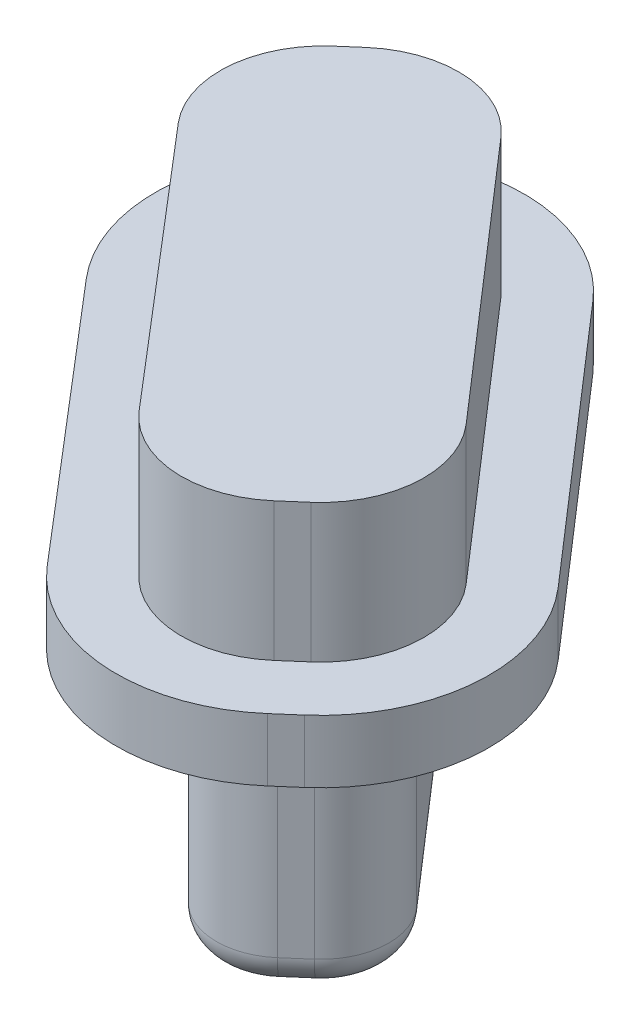
ISO-10303-21;
HEADER;
FILE_DESCRIPTION(('STEP AP214'),'2;1');
FILE_NAME('part.step','',(''),(''),'','','');
FILE_SCHEMA(('AUTOMOTIVE_DESIGN { 1 0 10303 214 1 1 1 1 }'));
ENDSEC;
DATA;
#1=APPLICATION_CONTEXT('core data for automotive mechanical design processes');
#2=APPLICATION_PROTOCOL_DEFINITION('international standard','automotive_design',2000,#1);
#3=PRODUCT_CONTEXT('',#1,'mechanical');
#4=PRODUCT('Part','Part','',(#3));
#5=PRODUCT_RELATED_PRODUCT_CATEGORY('part','',(#4));
#6=PRODUCT_DEFINITION_FORMATION('','',#4);
#7=PRODUCT_DEFINITION_CONTEXT('part definition',#1,'design');
#8=PRODUCT_DEFINITION('design','',#6,#7);
#9=PRODUCT_DEFINITION_SHAPE('','',#8);
#10=(LENGTH_UNIT() NAMED_UNIT(*) SI_UNIT(.MILLI.,.METRE.));
#11=(NAMED_UNIT(*) PLANE_ANGLE_UNIT() SI_UNIT($,.RADIAN.));
#12=(NAMED_UNIT(*) SI_UNIT($,.STERADIAN.) SOLID_ANGLE_UNIT());
#13=UNCERTAINTY_MEASURE_WITH_UNIT(LENGTH_MEASURE(1.E-05),#10,'distance_accuracy_value','');
#14=(GEOMETRIC_REPRESENTATION_CONTEXT(3) GLOBAL_UNCERTAINTY_ASSIGNED_CONTEXT((#13)) GLOBAL_UNIT_ASSIGNED_CONTEXT((#10,
#11,#12)) REPRESENTATION_CONTEXT('',''));
#15=CARTESIAN_POINT('',(0.,0.,0.));
#16=DIRECTION('',(0.,0.,1.));
#17=DIRECTION('',(1.,0.,0.));
#18=AXIS2_PLACEMENT_3D('',#15,#16,#17);
#19=CARTESIAN_POINT('',(-137.992702700744,7.,-158.742445613972));
#20=DIRECTION('',(-0.656059028990518,0.,-0.754709580222763));
#21=DIRECTION('',(-0.754709580222763,0.,0.656059028990518));
#22=AXIS2_PLACEMENT_3D('',#19,#20,#21);
#23=PLANE('',#22);
#24=DIRECTION('',(0.754709580222763,0.,-0.656059028990518));
#25=VECTOR('',#24,1.);
#26=CARTESIAN_POINT('',(-137.992702700744,0.,-158.742445613972));
#27=LINE('',#26,#25);
#28=CARTESIAN_POINT('',(-397.046660629011,0.,66.44972439188));
#29=VERTEX_POINT('',#28);
#30=CARTESIAN_POINT('',(-396.047807587358,0.,65.5814346897433));
#31=VERTEX_POINT('',#30);
#32=EDGE_CURVE('E340',#29,#31,#27,.T.);
#33=ORIENTED_EDGE('',*,*,#32,.T.);
#34=DIRECTION('',(0.,-1.,0.));
#35=VECTOR('',#34,1.);
#36=CARTESIAN_POINT('',(-396.047807587358,7.,65.5814346897433));
#37=LINE('',#36,#35);
#38=CARTESIAN_POINT('',(-396.047807587358,7.,65.5814346897433));
#39=VERTEX_POINT('',#38);
#40=EDGE_CURVE('E402',#39,#31,#37,.T.);
#41=ORIENTED_EDGE('',*,*,#40,.F.);
#42=DIRECTION('',(0.754709580222763,0.,-0.656059028990518));
#43=VECTOR('',#42,1.);
#44=CARTESIAN_POINT('',(-137.992702700744,7.,-158.742445613972));
#45=LINE('',#44,#43);
#46=CARTESIAN_POINT('',(-397.046660629011,7.,66.44972439188));
#47=VERTEX_POINT('',#46);
#48=EDGE_CURVE('E341',#47,#39,#45,.T.);
#49=ORIENTED_EDGE('',*,*,#48,.F.);
#50=DIRECTION('',(0.,-1.,0.));
#51=VECTOR('',#50,1.);
#52=CARTESIAN_POINT('',(-397.046660629011,7.,66.44972439188));
#53=LINE('',#52,#51);
#54=EDGE_CURVE('E360',#47,#29,#53,.T.);
#55=ORIENTED_EDGE('',*,*,#54,.T.);
#56=EDGE_LOOP('',(#33,#41,#49,#55));
#57=FACE_BOUND('',#56,.T.);
#58=ADVANCED_FACE('F41',(#57),#23,.F.);
#59=CARTESIAN_POINT('',(-399.463906951311,7.,61.6516619055234));
#60=DIRECTION('',(0.,-1.,0.));
#61=DIRECTION('',(0.,0.,-1.));
#62=AXIS2_PLACEMENT_3D('',#59,#60,#61);
#63=CYLINDRICAL_SURFACE('',#62,5.20699999999999);
#64=CARTESIAN_POINT('',(-399.463906951311,0.,61.6516619055234));
#65=DIRECTION('',(0.,1.,0.));
#66=DIRECTION('',(0.,0.,1.));
#67=AXIS2_PLACEMENT_3D('',#64,#65,#66);
#68=CIRCLE('',#67,5.20699999999999);
#69=CARTESIAN_POINT('',(-395.534134167091,0.,58.2355625415697));
#70=VERTEX_POINT('',#69);
#71=EDGE_CURVE('E363',#31,#70,#68,.T.);
#72=ORIENTED_EDGE('',*,*,#71,.T.);
#73=DIRECTION('',(0.,-1.,0.));
#74=VECTOR('',#73,1.);
#75=CARTESIAN_POINT('',(-395.534134167091,7.,58.2355625415697));
#76=LINE('',#75,#74);
#77=CARTESIAN_POINT('',(-395.534134167091,7.,58.2355625415697));
#78=VERTEX_POINT('',#77);
#79=EDGE_CURVE('E399',#78,#70,#76,.T.);
#80=ORIENTED_EDGE('',*,*,#79,.F.);
#81=CARTESIAN_POINT('',(-399.463906951311,7.,61.6516619055234));
#82=DIRECTION('',(0.,1.,0.));
#83=DIRECTION('',(0.,0.,1.));
#84=AXIS2_PLACEMENT_3D('',#81,#82,#83);
#85=CIRCLE('',#84,5.20699999999999);
#86=EDGE_CURVE('E344',#39,#78,#85,.T.);
#87=ORIENTED_EDGE('',*,*,#86,.F.);
#88=ORIENTED_EDGE('',*,*,#40,.T.);
#89=EDGE_LOOP('',(#72,#80,#87,#88));
#90=FACE_BOUND('',#89,.T.);
#91=ADVANCED_FACE('F513',(#90),#63,.T.);
#92=CARTESIAN_POINT('',(-254.125332102389,7.,220.907780939763));
#93=DIRECTION('',(-0.754709580222754,0.,0.656059028990528));
#94=DIRECTION('',(0.656059028990528,0.,0.754709580222754));
#95=AXIS2_PLACEMENT_3D('',#92,#93,#94);
#96=PLANE('',#95);
#97=DIRECTION('',(-0.656059028990528,0.,-0.754709580222754));
#98=VECTOR('',#97,1.);
#99=CARTESIAN_POINT('',(-254.125332102389,0.,220.907780939763));
#100=LINE('',#99,#98);
#101=CARTESIAN_POINT('',(-407.251348424862,0.,44.7564494387913));
#102=VERTEX_POINT('',#101);
#103=EDGE_CURVE('E366',#70,#102,#100,.T.);
#104=ORIENTED_EDGE('',*,*,#103,.T.);
#105=DIRECTION('',(0.,-1.,0.));
#106=VECTOR('',#105,1.);
#107=CARTESIAN_POINT('',(-407.251348424862,7.,44.7564494387913));
#108=LINE('',#107,#106);
#109=CARTESIAN_POINT('',(-407.251348424862,7.,44.7564494387913));
#110=VERTEX_POINT('',#109);
#111=EDGE_CURVE('E396',#110,#102,#108,.T.);
#112=ORIENTED_EDGE('',*,*,#111,.F.);
#113=DIRECTION('',(-0.656059028990528,0.,-0.754709580222754));
#114=VECTOR('',#113,1.);
#115=CARTESIAN_POINT('',(-254.125332102389,7.,220.907780939763));
#116=LINE('',#115,#114);
#117=EDGE_CURVE('E347',#78,#110,#116,.T.);
#118=ORIENTED_EDGE('',*,*,#117,.F.);
#119=ORIENTED_EDGE('',*,*,#79,.T.);
#120=EDGE_LOOP('',(#104,#112,#118,#119));
#121=FACE_BOUND('',#120,.T.);
#122=ADVANCED_FACE('F519',(#121),#96,.F.);
#123=CARTESIAN_POINT('',(-411.181121209082,7.,48.172548802745));
#124=DIRECTION('',(0.,-1.,0.));
#125=DIRECTION('',(0.,0.,-1.));
#126=AXIS2_PLACEMENT_3D('',#123,#124,#125);
#127=CYLINDRICAL_SURFACE('',#126,5.207);
#128=CARTESIAN_POINT('',(-411.181121209082,0.,48.172548802745));
#129=DIRECTION('',(0.,1.,0.));
#130=DIRECTION('',(0.,0.,1.));
#131=AXIS2_PLACEMENT_3D('',#128,#129,#130);
#132=CIRCLE('',#131,5.207);
#133=CARTESIAN_POINT('',(-414.597220573036,0.,44.2427760185252));
#134=VERTEX_POINT('',#133);
#135=EDGE_CURVE('E369',#102,#134,#132,.T.);
#136=ORIENTED_EDGE('',*,*,#135,.T.);
#137=DIRECTION('',(0.,-1.,0.));
#138=VECTOR('',#137,1.);
#139=CARTESIAN_POINT('',(-414.597220573036,7.,44.2427760185252));
#140=LINE('',#139,#138);
#141=CARTESIAN_POINT('',(-414.597220573036,7.,44.2427760185252));
#142=VERTEX_POINT('',#141);
#143=EDGE_CURVE('E393',#142,#134,#140,.T.);
#144=ORIENTED_EDGE('',*,*,#143,.F.);
#145=CARTESIAN_POINT('',(-411.181121209082,7.,48.172548802745));
#146=DIRECTION('',(0.,1.,0.));
#147=DIRECTION('',(0.,0.,1.));
#148=AXIS2_PLACEMENT_3D('',#145,#146,#147);
#149=CIRCLE('',#148,5.207);
#150=EDGE_CURVE('E349',#110,#142,#149,.T.);
#151=ORIENTED_EDGE('',*,*,#150,.F.);
#152=ORIENTED_EDGE('',*,*,#111,.T.);
#153=EDGE_LOOP('',(#136,#144,#151,#152));
#154=FACE_BOUND('',#153,.T.);
#155=ADVANCED_FACE('F833',(#154),#127,.T.);
#156=CARTESIAN_POINT('',(-156.542115686429,7.,-180.081104285192));
#157=DIRECTION('',(0.656059028990531,0.,0.754709580222751));
#158=DIRECTION('',(0.754709580222751,0.,-0.656059028990531));
#159=AXIS2_PLACEMENT_3D('',#156,#157,#158);
#160=PLANE('',#159);
#161=DIRECTION('',(-0.754709580222751,0.,0.656059028990531));
#162=VECTOR('',#161,1.);
#163=CARTESIAN_POINT('',(-156.542115686429,0.,-180.081104285192));
#164=LINE('',#163,#162);
#165=CARTESIAN_POINT('',(-415.480745160767,0.,45.0108122251744));
#166=VERTEX_POINT('',#165);
#167=EDGE_CURVE('E372',#134,#166,#164,.T.);
#168=ORIENTED_EDGE('',*,*,#167,.T.);
#169=DIRECTION('',(0.,-1.,0.));
#170=VECTOR('',#169,1.);
#171=CARTESIAN_POINT('',(-415.480745160767,7.,45.0108122251744));
#172=LINE('',#171,#170);
#173=CARTESIAN_POINT('',(-415.480745160767,7.,45.0108122251744));
#174=VERTEX_POINT('',#173);
#175=EDGE_CURVE('E390',#174,#166,#172,.T.);
#176=ORIENTED_EDGE('',*,*,#175,.F.);
#177=DIRECTION('',(-0.754709580222751,0.,0.656059028990531));
#178=VECTOR('',#177,1.);
#179=CARTESIAN_POINT('',(-156.542115686429,7.,-180.081104285192));
#180=LINE('',#179,#178);
#181=EDGE_CURVE('E351',#142,#174,#180,.T.);
#182=ORIENTED_EDGE('',*,*,#181,.F.);
#183=ORIENTED_EDGE('',*,*,#143,.T.);
#184=EDGE_LOOP('',(#168,#176,#182,#183));
#185=FACE_BOUND('',#184,.T.);
#186=ADVANCED_FACE('F822',(#185),#160,.F.);
#187=CARTESIAN_POINT('',(-412.064645796813,7.,48.9405850093943));
#188=DIRECTION('',(0.,-1.,0.));
#189=DIRECTION('',(0.,0.,-1.));
#190=AXIS2_PLACEMENT_3D('',#187,#188,#189);
#191=CYLINDRICAL_SURFACE('',#190,5.20700000000003);
#192=CARTESIAN_POINT('',(-412.064645796813,0.,48.9405850093943));
#193=DIRECTION('',(0.,1.,0.));
#194=DIRECTION('',(0.,0.,1.));
#195=AXIS2_PLACEMENT_3D('',#192,#193,#194);
#196=CIRCLE('',#195,5.20700000000003);
#197=CARTESIAN_POINT('',(-416.023502117162,0.,52.3229370955661));
#198=VERTEX_POINT('',#197);
#199=EDGE_CURVE('E375',#166,#198,#196,.T.);
#200=ORIENTED_EDGE('',*,*,#199,.T.);
#201=DIRECTION('',(0.,-1.,0.));
#202=VECTOR('',#201,1.);
#203=CARTESIAN_POINT('',(-416.023502117162,7.,52.3229370955661));
#204=LINE('',#203,#202);
#205=CARTESIAN_POINT('',(-416.023502117162,7.,52.3229370955661));
#206=VERTEX_POINT('',#205);
#207=EDGE_CURVE('E387',#206,#198,#204,.T.);
#208=ORIENTED_EDGE('',*,*,#207,.F.);
#209=CARTESIAN_POINT('',(-412.064645796813,7.,48.9405850093943));
#210=DIRECTION('',(0.,1.,0.));
#211=DIRECTION('',(0.,0.,1.));
#212=AXIS2_PLACEMENT_3D('',#209,#210,#211);
#213=CIRCLE('',#212,5.20700000000003);
#214=EDGE_CURVE('E353',#174,#206,#213,.T.);
#215=ORIENTED_EDGE('',*,*,#214,.F.);
#216=ORIENTED_EDGE('',*,*,#175,.T.);
#217=EDGE_LOOP('',(#200,#208,#215,#216));
#218=FACE_BOUND('',#217,.T.);
#219=ADVANCED_FACE('F811',(#218),#191,.T.);
#220=CARTESIAN_POINT('',(-266.32256070024,7.,227.539621518675));
#221=DIRECTION('',(-0.760295049039607,0.,0.649577892485467));
#222=DIRECTION('',(0.649577892485467,0.,0.760295049039607));
#223=AXIS2_PLACEMENT_3D('',#220,#221,#222);
#224=PLANE('',#223);
#225=DIRECTION('',(-0.649577892485467,0.,-0.760295049039607));
#226=VECTOR('',#225,1.);
#227=CARTESIAN_POINT('',(-266.32256070024,0.,227.539621518675));
#228=LINE('',#227,#226);
#229=CARTESIAN_POINT('',(-404.421616313314,0.,65.9023036938319));
#230=VERTEX_POINT('',#229);
#231=EDGE_CURVE('E378',#230,#198,#228,.T.);
#232=ORIENTED_EDGE('',*,*,#231,.F.);
#233=DIRECTION('',(0.,-1.,0.));
#234=VECTOR('',#233,1.);
#235=CARTESIAN_POINT('',(-404.421616313314,7.,65.9023036938319));
#236=LINE('',#235,#234);
#237=CARTESIAN_POINT('',(-404.421616313314,7.,65.9023036938319));
#238=VERTEX_POINT('',#237);
#239=EDGE_CURVE('E384',#238,#230,#236,.T.);
#240=ORIENTED_EDGE('',*,*,#239,.F.);
#241=DIRECTION('',(-0.649577892485467,0.,-0.760295049039607));
#242=VECTOR('',#241,1.);
#243=CARTESIAN_POINT('',(-266.32256070024,7.,227.539621518675));
#244=LINE('',#243,#242);
#245=EDGE_CURVE('E355',#238,#206,#244,.T.);
#246=ORIENTED_EDGE('',*,*,#245,.T.);
#247=ORIENTED_EDGE('',*,*,#207,.T.);
#248=EDGE_LOOP('',(#232,#240,#246,#247));
#249=FACE_BOUND('',#248,.T.);
#250=ADVANCED_FACE('F800',(#249),#224,.T.);
#251=CARTESIAN_POINT('',(-400.462759992965,7.,62.5199516076601));
#252=DIRECTION('',(0.,-1.,0.));
#253=DIRECTION('',(0.,0.,-1.));
#254=AXIS2_PLACEMENT_3D('',#251,#252,#253);
#255=CYLINDRICAL_SURFACE('',#254,5.20699999999996);
#256=CARTESIAN_POINT('',(-400.462759992965,0.,62.5199516076601));
#257=DIRECTION('',(0.,1.,0.));
#258=DIRECTION('',(0.,0.,1.));
#259=AXIS2_PLACEMENT_3D('',#256,#257,#258);
#260=CIRCLE('',#259,5.20699999999996);
#261=EDGE_CURVE('E345',#230,#29,#260,.T.);
#262=ORIENTED_EDGE('',*,*,#261,.T.);
#263=ORIENTED_EDGE('',*,*,#54,.F.);
#264=CARTESIAN_POINT('',(-400.462759992965,7.,62.5199516076601));
#265=DIRECTION('',(0.,1.,0.));
#266=DIRECTION('',(0.,0.,1.));
#267=AXIS2_PLACEMENT_3D('',#264,#265,#266);
#268=CIRCLE('',#267,5.20699999999996);
#269=EDGE_CURVE('E358',#238,#47,#268,.T.);
#270=ORIENTED_EDGE('',*,*,#269,.F.);
#271=ORIENTED_EDGE('',*,*,#239,.T.);
#272=EDGE_LOOP('',(#262,#263,#270,#271));
#273=FACE_BOUND('',#272,.T.);
#274=ADVANCED_FACE('F790',(#273),#255,.T.);
#275=CARTESIAN_POINT('',(0.,7.,0.));
#276=DIRECTION('',(0.,1.,0.));
#277=DIRECTION('',(0.,0.,1.));
#278=AXIS2_PLACEMENT_3D('',#275,#276,#277);
#279=PLANE('',#278);
#280=ORIENTED_EDGE('',*,*,#48,.T.);
#281=ORIENTED_EDGE('',*,*,#86,.T.);
#282=ORIENTED_EDGE('',*,*,#117,.T.);
#283=ORIENTED_EDGE('',*,*,#150,.T.);
#284=ORIENTED_EDGE('',*,*,#181,.T.);
#285=ORIENTED_EDGE('',*,*,#214,.T.);
#286=ORIENTED_EDGE('',*,*,#245,.F.);
#287=ORIENTED_EDGE('',*,*,#269,.T.);
#288=EDGE_LOOP('',(#280,#281,#282,#283,#284,#285,#286,#287));
#289=FACE_BOUND('',#288,.T.);
#290=ADVANCED_FACE('F778',(#289),#279,.T.);
#291=CARTESIAN_POINT('',(-135.826395786993,-3.175,-156.250394580069));
#292=DIRECTION('',(-0.656059028990471,0.,-0.754709580222804));
#293=DIRECTION('',(-0.754709580222804,0.,0.656059028990471));
#294=AXIS2_PLACEMENT_3D('',#291,#292,#293);
#295=PLANE('',#294);
#296=DIRECTION('',(-0.754709580222804,0.,0.656059028990471));
#297=VECTOR('',#296,1.);
#298=CARTESIAN_POINT('',(-135.826395786993,0.,-156.250394580069));
#299=LINE('',#298,#297);
#300=CARTESIAN_POINT('',(-393.881500673628,0.,68.0734857236366));
#301=VERTEX_POINT('',#300);
#302=CARTESIAN_POINT('',(-394.880353715284,0.,68.9417754257754));
#303=VERTEX_POINT('',#302);
#304=EDGE_CURVE('E282',#301,#303,#299,.T.);
#305=ORIENTED_EDGE('',*,*,#304,.T.);
#306=DIRECTION('',(0.,1.,0.));
#307=VECTOR('',#306,1.);
#308=CARTESIAN_POINT('',(-394.880353715284,-3.175,68.9417754257754));
#309=LINE('',#308,#307);
#310=CARTESIAN_POINT('',(-394.880353715284,-3.175,68.9417754257754));
#311=VERTEX_POINT('',#310);
#312=EDGE_CURVE('E337',#311,#303,#309,.T.);
#313=ORIENTED_EDGE('',*,*,#312,.F.);
#314=DIRECTION('',(-0.754709580222804,0.,0.656059028990471));
#315=VECTOR('',#314,1.);
#316=CARTESIAN_POINT('',(-135.826395786993,-3.175,-156.250394580069));
#317=LINE('',#316,#315);
#318=CARTESIAN_POINT('',(-393.881500673628,-3.175,68.0734857236366));
#319=VERTEX_POINT('',#318);
#320=EDGE_CURVE('E283',#319,#311,#317,.T.);
#321=ORIENTED_EDGE('',*,*,#320,.F.);
#322=DIRECTION('',(0.,1.,0.));
#323=VECTOR('',#322,1.);
#324=CARTESIAN_POINT('',(-393.881500673628,-3.175,68.0734857236366));
#325=LINE('',#324,#323);
#326=EDGE_CURVE('E301',#319,#301,#325,.T.);
#327=ORIENTED_EDGE('',*,*,#326,.T.);
#328=EDGE_LOOP('',(#305,#313,#321,#327));
#329=FACE_BOUND('',#328,.T.);
#330=ADVANCED_FACE('F767',(#329),#295,.F.);
#331=CARTESIAN_POINT('',(-400.462759992965,-3.175,62.5199516076601));
#332=DIRECTION('',(0.,1.,0.));
#333=DIRECTION('',(0.,0.,1.));
#334=AXIS2_PLACEMENT_3D('',#331,#332,#333);
#335=CYLINDRICAL_SURFACE('',#334,8.50899999999996);
#336=CARTESIAN_POINT('',(-400.462759992965,0.,62.5199516076601));
#337=DIRECTION('',(0.,-1.,0.));
#338=DIRECTION('',(0.,0.,-1.));
#339=AXIS2_PLACEMENT_3D('',#336,#337,#338);
#340=CIRCLE('',#339,8.50899999999996);
#341=CARTESIAN_POINT('',(-406.932110565243,0.,68.0472098948189));
#342=VERTEX_POINT('',#341);
#343=EDGE_CURVE('E304',#303,#342,#340,.T.);
#344=ORIENTED_EDGE('',*,*,#343,.T.);
#345=DIRECTION('',(0.,1.,0.));
#346=VECTOR('',#345,1.);
#347=CARTESIAN_POINT('',(-406.932110565243,-3.175,68.0472098948189));
#348=LINE('',#347,#346);
#349=CARTESIAN_POINT('',(-406.932110565243,-3.175,68.0472098948189));
#350=VERTEX_POINT('',#349);
#351=EDGE_CURVE('E334',#350,#342,#348,.T.);
#352=ORIENTED_EDGE('',*,*,#351,.F.);
#353=CARTESIAN_POINT('',(-400.462759992965,-3.175,62.5199516076601));
#354=DIRECTION('',(0.,-1.,0.));
#355=DIRECTION('',(0.,0.,-1.));
#356=AXIS2_PLACEMENT_3D('',#353,#354,#355);
#357=CIRCLE('',#356,8.50899999999996);
#358=EDGE_CURVE('E286',#311,#350,#357,.T.);
#359=ORIENTED_EDGE('',*,*,#358,.F.);
#360=ORIENTED_EDGE('',*,*,#312,.T.);
#361=EDGE_LOOP('',(#344,#352,#359,#360));
#362=FACE_BOUND('',#361,.T.);
#363=ADVANCED_FACE('F756',(#362),#335,.T.);
#364=CARTESIAN_POINT('',(-268.833054952169,-3.175,229.684527719662));
#365=DIRECTION('',(0.760295049039608,0.,-0.649577892485466));
#366=DIRECTION('',(-0.649577892485466,0.,-0.760295049039608));
#367=AXIS2_PLACEMENT_3D('',#364,#365,#366);
#368=PLANE('',#367);
#369=DIRECTION('',(-0.649577892485466,0.,-0.760295049039608));
#370=VECTOR('',#369,1.);
#371=CARTESIAN_POINT('',(-268.833054952169,0.,229.684527719662));
#372=LINE('',#371,#370);
#373=CARTESIAN_POINT('',(-418.533996369091,0.,54.4678432965531));
#374=VERTEX_POINT('',#373);
#375=EDGE_CURVE('E306',#342,#374,#372,.T.);
#376=ORIENTED_EDGE('',*,*,#375,.T.);
#377=DIRECTION('',(0.,1.,0.));
#378=VECTOR('',#377,1.);
#379=CARTESIAN_POINT('',(-418.533996369091,-3.175,54.4678432965531));
#380=LINE('',#379,#378);
#381=CARTESIAN_POINT('',(-418.533996369091,-3.175,54.4678432965531));
#382=VERTEX_POINT('',#381);
#383=EDGE_CURVE('E331',#382,#374,#380,.T.);
#384=ORIENTED_EDGE('',*,*,#383,.F.);
#385=DIRECTION('',(-0.649577892485466,0.,-0.760295049039608));
#386=VECTOR('',#385,1.);
#387=CARTESIAN_POINT('',(-268.833054952169,-3.175,229.684527719662));
#388=LINE('',#387,#386);
#389=EDGE_CURVE('E289',#350,#382,#388,.T.);
#390=ORIENTED_EDGE('',*,*,#389,.F.);
#391=ORIENTED_EDGE('',*,*,#351,.T.);
#392=EDGE_LOOP('',(#376,#384,#390,#391));
#393=FACE_BOUND('',#392,.T.);
#394=ADVANCED_FACE('F745',(#393),#368,.F.);
#395=CARTESIAN_POINT('',(-412.064645796813,-3.175,48.9405850093943));
#396=DIRECTION('',(0.,1.,0.));
#397=DIRECTION('',(0.,0.,1.));
#398=AXIS2_PLACEMENT_3D('',#395,#396,#397);
#399=CYLINDRICAL_SURFACE('',#398,8.50899999999999);
#400=CARTESIAN_POINT('',(-412.064645796813,0.,48.9405850093943));
#401=DIRECTION('',(0.,-1.,0.));
#402=DIRECTION('',(0.,0.,-1.));
#403=AXIS2_PLACEMENT_3D('',#400,#401,#402);
#404=CIRCLE('',#403,8.50899999999999);
#405=CARTESIAN_POINT('',(-417.647052074491,0.,42.5187611912763));
#406=VERTEX_POINT('',#405);
#407=EDGE_CURVE('E308',#374,#406,#404,.T.);
#408=ORIENTED_EDGE('',*,*,#407,.T.);
#409=DIRECTION('',(0.,1.,0.));
#410=VECTOR('',#409,1.);
#411=CARTESIAN_POINT('',(-417.647052074491,-3.175,42.5187611912763));
#412=LINE('',#411,#410);
#413=CARTESIAN_POINT('',(-417.647052074491,-3.175,42.5187611912763));
#414=VERTEX_POINT('',#413);
#415=EDGE_CURVE('E328',#414,#406,#412,.T.);
#416=ORIENTED_EDGE('',*,*,#415,.F.);
#417=CARTESIAN_POINT('',(-412.064645796813,-3.175,48.9405850093943));
#418=DIRECTION('',(0.,-1.,0.));
#419=DIRECTION('',(0.,0.,-1.));
#420=AXIS2_PLACEMENT_3D('',#417,#418,#419);
#421=CIRCLE('',#420,8.50899999999999);
#422=EDGE_CURVE('E291',#382,#414,#421,.T.);
#423=ORIENTED_EDGE('',*,*,#422,.F.);
#424=ORIENTED_EDGE('',*,*,#383,.T.);
#425=EDGE_LOOP('',(#408,#416,#423,#424));
#426=FACE_BOUND('',#425,.T.);
#427=ADVANCED_FACE('F734',(#426),#399,.T.);
#428=CARTESIAN_POINT('',(-158.70842260016,-3.175,-182.573155319089));
#429=DIRECTION('',(0.65605902899054,0.,0.754709580222743));
#430=DIRECTION('',(0.754709580222743,0.,-0.65605902899054));
#431=AXIS2_PLACEMENT_3D('',#428,#429,#430);
#432=PLANE('',#431);
#433=DIRECTION('',(0.754709580222744,0.,-0.65605902899054));
#434=VECTOR('',#433,1.);
#435=CARTESIAN_POINT('',(-158.70842260016,0.,-182.573155319089));
#436=LINE('',#435,#434);
#437=CARTESIAN_POINT('',(-416.763527486763,0.,41.7507249846297));
#438=VERTEX_POINT('',#437);
#439=EDGE_CURVE('E310',#406,#438,#436,.T.);
#440=ORIENTED_EDGE('',*,*,#439,.T.);
#441=DIRECTION('',(0.,1.,0.));
#442=VECTOR('',#441,1.);
#443=CARTESIAN_POINT('',(-416.763527486763,-3.175,41.7507249846297));
#444=LINE('',#443,#442);
#445=CARTESIAN_POINT('',(-416.763527486763,-3.175,41.7507249846297));
#446=VERTEX_POINT('',#445);
#447=EDGE_CURVE('E325',#446,#438,#444,.T.);
#448=ORIENTED_EDGE('',*,*,#447,.F.);
#449=DIRECTION('',(0.754709580222744,0.,-0.65605902899054));
#450=VECTOR('',#449,1.);
#451=CARTESIAN_POINT('',(-158.70842260016,-3.175,-182.573155319089));
#452=LINE('',#451,#450);
#453=EDGE_CURVE('E293',#414,#446,#452,.T.);
#454=ORIENTED_EDGE('',*,*,#453,.F.);
#455=ORIENTED_EDGE('',*,*,#415,.T.);
#456=EDGE_LOOP('',(#440,#448,#454,#455));
#457=FACE_BOUND('',#456,.T.);
#458=ADVANCED_FACE('F723',(#457),#432,.F.);
#459=CARTESIAN_POINT('',(-411.181121209082,-3.175,48.172548802745));
#460=DIRECTION('',(0.,1.,0.));
#461=DIRECTION('',(0.,0.,1.));
#462=AXIS2_PLACEMENT_3D('',#459,#460,#461);
#463=CYLINDRICAL_SURFACE('',#462,8.50900000000002);
#464=CARTESIAN_POINT('',(-411.181121209082,0.,48.172548802745));
#465=DIRECTION('',(0.,-1.,0.));
#466=DIRECTION('',(0.,0.,-1.));
#467=AXIS2_PLACEMENT_3D('',#464,#465,#466);
#468=CIRCLE('',#467,8.50900000000002);
#469=CARTESIAN_POINT('',(-404.759297390967,0.,42.5901425250645));
#470=VERTEX_POINT('',#469);
#471=EDGE_CURVE('E312',#438,#470,#468,.T.);
#472=ORIENTED_EDGE('',*,*,#471,.T.);
#473=DIRECTION('',(0.,1.,0.));
#474=VECTOR('',#473,1.);
#475=CARTESIAN_POINT('',(-404.759297390967,-3.175,42.5901425250645));
#476=LINE('',#475,#474);
#477=CARTESIAN_POINT('',(-404.759297390967,-3.175,42.5901425250645));
#478=VERTEX_POINT('',#477);
#479=EDGE_CURVE('E322',#478,#470,#476,.T.);
#480=ORIENTED_EDGE('',*,*,#479,.F.);
#481=CARTESIAN_POINT('',(-411.181121209082,-3.175,48.172548802745));
#482=DIRECTION('',(0.,-1.,0.));
#483=DIRECTION('',(0.,0.,-1.));
#484=AXIS2_PLACEMENT_3D('',#481,#482,#483);
#485=CIRCLE('',#484,8.50900000000002);
#486=EDGE_CURVE('E295',#446,#478,#485,.T.);
#487=ORIENTED_EDGE('',*,*,#486,.F.);
#488=ORIENTED_EDGE('',*,*,#447,.T.);
#489=EDGE_LOOP('',(#472,#480,#487,#488));
#490=FACE_BOUND('',#489,.T.);
#491=ADVANCED_FACE('F712',(#490),#463,.T.);
#492=CARTESIAN_POINT('',(-251.633281068493,-3.175,218.741474026037));
#493=DIRECTION('',(-0.754709580222753,0.,0.656059028990529));
#494=DIRECTION('',(0.656059028990529,0.,0.754709580222753));
#495=AXIS2_PLACEMENT_3D('',#492,#493,#494);
#496=PLANE('',#495);
#497=DIRECTION('',(0.656059028990529,0.,0.754709580222753));
#498=VECTOR('',#497,1.);
#499=CARTESIAN_POINT('',(-251.633281068493,0.,218.741474026037));
#500=LINE('',#499,#498);
#501=CARTESIAN_POINT('',(-393.042083133196,0.,56.069255627843));
#502=VERTEX_POINT('',#501);
#503=EDGE_CURVE('E314',#470,#502,#500,.T.);
#504=ORIENTED_EDGE('',*,*,#503,.T.);
#505=DIRECTION('',(0.,1.,0.));
#506=VECTOR('',#505,1.);
#507=CARTESIAN_POINT('',(-393.042083133196,-3.175,56.069255627843));
#508=LINE('',#507,#506);
#509=CARTESIAN_POINT('',(-393.042083133196,-3.175,56.069255627843));
#510=VERTEX_POINT('',#509);
#511=EDGE_CURVE('E319',#510,#502,#508,.T.);
#512=ORIENTED_EDGE('',*,*,#511,.F.);
#513=DIRECTION('',(0.656059028990529,0.,0.754709580222753));
#514=VECTOR('',#513,1.);
#515=CARTESIAN_POINT('',(-251.633281068493,-3.175,218.741474026037));
#516=LINE('',#515,#514);
#517=EDGE_CURVE('E297',#478,#510,#516,.T.);
#518=ORIENTED_EDGE('',*,*,#517,.F.);
#519=ORIENTED_EDGE('',*,*,#479,.T.);
#520=EDGE_LOOP('',(#504,#512,#518,#519));
#521=FACE_BOUND('',#520,.T.);
#522=ADVANCED_FACE('F701',(#521),#496,.F.);
#523=CARTESIAN_POINT('',(-399.463906951311,-3.175,61.6516619055234));
#524=DIRECTION('',(0.,1.,0.));
#525=DIRECTION('',(0.,0.,1.));
#526=AXIS2_PLACEMENT_3D('',#523,#524,#525);
#527=CYLINDRICAL_SURFACE('',#526,8.50900000000006);
#528=CARTESIAN_POINT('',(-399.463906951311,0.,61.6516619055234));
#529=DIRECTION('',(0.,-1.,0.));
#530=DIRECTION('',(0.,0.,-1.));
#531=AXIS2_PLACEMENT_3D('',#528,#529,#530);
#532=CIRCLE('',#531,8.50900000000006);
#533=EDGE_CURVE('E287',#502,#301,#532,.T.);
#534=ORIENTED_EDGE('',*,*,#533,.T.);
#535=ORIENTED_EDGE('',*,*,#326,.F.);
#536=CARTESIAN_POINT('',(-399.463906951311,-3.175,61.6516619055234));
#537=DIRECTION('',(0.,-1.,0.));
#538=DIRECTION('',(0.,0.,-1.));
#539=AXIS2_PLACEMENT_3D('',#536,#537,#538);
#540=CIRCLE('',#539,8.50900000000006);
#541=EDGE_CURVE('E299',#510,#319,#540,.T.);
#542=ORIENTED_EDGE('',*,*,#541,.F.);
#543=ORIENTED_EDGE('',*,*,#511,.T.);
#544=EDGE_LOOP('',(#534,#535,#542,#543));
#545=FACE_BOUND('',#544,.T.);
#546=ADVANCED_FACE('F692',(#545),#527,.T.);
#547=CARTESIAN_POINT('',(0.,-3.175,0.));
#548=DIRECTION('',(0.,-1.,0.));
#549=DIRECTION('',(0.,0.,-1.));
#550=AXIS2_PLACEMENT_3D('',#547,#548,#549);
#551=PLANE('',#550);
#552=DIRECTION('',(-0.754709580222774,0.,0.656059028990505));
#553=VECTOR('',#552,1.);
#554=CARTESIAN_POINT('',(-139.159175654282,-3.175,-160.084319247606));
#555=LINE('',#554,#553);
#556=CARTESIAN_POINT('',(-397.214280540902,-3.175,64.2395610561063));
#557=VERTEX_POINT('',#556);
#558=CARTESIAN_POINT('',(-398.213133582556,-3.175,65.1078507582436));
#559=VERTEX_POINT('',#558);
#560=EDGE_CURVE('E253',#557,#559,#555,.T.);
#561=ORIENTED_EDGE('',*,*,#560,.F.);
#562=CARTESIAN_POINT('',(-399.463906951311,-3.175,61.6516619055234));
#563=DIRECTION('',(0.,-1.,0.));
#564=DIRECTION('',(0.,0.,-1.));
#565=AXIS2_PLACEMENT_3D('',#562,#563,#564);
#566=CIRCLE('',#565,3.42900000000002);
#567=CARTESIAN_POINT('',(-396.876007800727,-3.175,59.4020354951149));
#568=VERTEX_POINT('',#567);
#569=EDGE_CURVE('E267',#568,#557,#566,.T.);
#570=ORIENTED_EDGE('',*,*,#569,.F.);
#571=DIRECTION('',(0.65605902899053,0.,0.754709580222752));
#572=VECTOR('',#571,1.);
#573=CARTESIAN_POINT('',(-255.467205736024,-3.175,222.074253893309));
#574=LINE('',#573,#572);
#575=CARTESIAN_POINT('',(-408.593222058498,-3.175,45.9229223923364));
#576=VERTEX_POINT('',#575);
#577=EDGE_CURVE('E264',#576,#568,#574,.T.);
#578=ORIENTED_EDGE('',*,*,#577,.F.);
#579=CARTESIAN_POINT('',(-411.181121209082,-3.175,48.172548802745));
#580=DIRECTION('',(0.,-1.,0.));
#581=DIRECTION('',(0.,0.,-1.));
#582=AXIS2_PLACEMENT_3D('',#579,#580,#581);
#583=CIRCLE('',#582,3.42899999999999);
#584=CARTESIAN_POINT('',(-413.430747619491,-3.175,45.5846496521613));
#585=VERTEX_POINT('',#584);
#586=EDGE_CURVE('E261',#585,#576,#583,.T.);
#587=ORIENTED_EDGE('',*,*,#586,.F.);
#588=DIRECTION('',(0.754709580222745,0.,-0.656059028990538));
#589=VECTOR('',#588,1.);
#590=CARTESIAN_POINT('',(-155.375642732887,-3.175,-178.739230651557));
#591=LINE('',#590,#589);
#592=CARTESIAN_POINT('',(-414.314272207221,-3.175,46.3526858588094));
#593=VERTEX_POINT('',#592);
#594=EDGE_CURVE('E258',#593,#585,#591,.T.);
#595=ORIENTED_EDGE('',*,*,#594,.F.);
#596=CARTESIAN_POINT('',(-412.064645796813,-3.175,48.9405850093943));
#597=DIRECTION('',(0.,-1.,0.));
#598=DIRECTION('',(0.,0.,-1.));
#599=AXIS2_PLACEMENT_3D('',#596,#597,#598);
#600=CIRCLE('',#599,3.42900000000001);
#601=CARTESIAN_POINT('',(-414.67169751997,-3.175,51.167987602727));
#602=VERTEX_POINT('',#601);
#603=EDGE_CURVE('E250',#602,#593,#600,.T.);
#604=ORIENTED_EDGE('',*,*,#603,.F.);
#605=DIRECTION('',(-0.649577892485465,0.,-0.760295049039609));
#606=VECTOR('',#605,1.);
#607=CARTESIAN_POINT('',(-264.970756103049,-3.175,226.384672025836));
#608=LINE('',#607,#606);
#609=CARTESIAN_POINT('',(-403.069811716121,-3.175,64.7473542009927));
#610=VERTEX_POINT('',#609);
#611=EDGE_CURVE('E231',#610,#602,#608,.T.);
#612=ORIENTED_EDGE('',*,*,#611,.F.);
#613=CARTESIAN_POINT('',(-400.462759992965,-3.175,62.5199516076601));
#614=DIRECTION('',(0.,-1.,0.));
#615=DIRECTION('',(0.,0.,-1.));
#616=AXIS2_PLACEMENT_3D('',#613,#614,#615);
#617=CIRCLE('',#616,3.42899999999999);
#618=EDGE_CURVE('E246',#559,#610,#617,.T.);
#619=ORIENTED_EDGE('',*,*,#618,.F.);
#620=EDGE_LOOP('',(#561,#570,#578,#587,#595,#604,#612,#619));
#621=FACE_BOUND('',#620,.T.);
#622=ORIENTED_EDGE('',*,*,#320,.T.);
#623=ORIENTED_EDGE('',*,*,#358,.T.);
#624=ORIENTED_EDGE('',*,*,#389,.T.);
#625=ORIENTED_EDGE('',*,*,#422,.T.);
#626=ORIENTED_EDGE('',*,*,#453,.T.);
#627=ORIENTED_EDGE('',*,*,#486,.T.);
#628=ORIENTED_EDGE('',*,*,#517,.T.);
#629=ORIENTED_EDGE('',*,*,#541,.T.);
#630=EDGE_LOOP('',(#622,#623,#624,#625,#626,#627,#628,#629));
#631=FACE_BOUND('',#630,.T.);
#632=ADVANCED_FACE('F244',(#621,#631),#551,.T.);
#633=CARTESIAN_POINT('',(0.,0.,0.));
#634=DIRECTION('',(0.,-1.,0.));
#635=DIRECTION('',(0.,0.,-1.));
#636=AXIS2_PLACEMENT_3D('',#633,#634,#635);
#637=PLANE('',#636);
#638=ORIENTED_EDGE('',*,*,#32,.F.);
#639=ORIENTED_EDGE('',*,*,#261,.F.);
#640=ORIENTED_EDGE('',*,*,#231,.T.);
#641=ORIENTED_EDGE('',*,*,#199,.F.);
#642=ORIENTED_EDGE('',*,*,#167,.F.);
#643=ORIENTED_EDGE('',*,*,#135,.F.);
#644=ORIENTED_EDGE('',*,*,#103,.F.);
#645=ORIENTED_EDGE('',*,*,#71,.F.);
#646=EDGE_LOOP('',(#638,#639,#640,#641,#642,#643,#644,#645));
#647=FACE_BOUND('',#646,.T.);
#648=ORIENTED_EDGE('',*,*,#304,.F.);
#649=ORIENTED_EDGE('',*,*,#533,.F.);
#650=ORIENTED_EDGE('',*,*,#503,.F.);
#651=ORIENTED_EDGE('',*,*,#471,.F.);
#652=ORIENTED_EDGE('',*,*,#439,.F.);
#653=ORIENTED_EDGE('',*,*,#407,.F.);
#654=ORIENTED_EDGE('',*,*,#375,.F.);
#655=ORIENTED_EDGE('',*,*,#343,.F.);
#656=EDGE_LOOP('',(#648,#649,#650,#651,#652,#653,#654,#655));
#657=FACE_BOUND('',#656,.T.);
#658=ADVANCED_FACE('F671',(#647,#657),#637,.F.);
#659=CARTESIAN_POINT('',(-139.159175654282,-15.875,-160.084319247606));
#660=DIRECTION('',(-0.656059028990505,0.,-0.754709580222774));
#661=DIRECTION('',(-0.754709580222774,0.,0.656059028990505));
#662=AXIS2_PLACEMENT_3D('',#659,#660,#661);
#663=PLANE('',#662);
#664=DIRECTION('',(0.,1.,0.));
#665=VECTOR('',#664,1.);
#666=CARTESIAN_POINT('',(-398.213133582556,-15.875,65.1078507582436));
#667=LINE('',#666,#665);
#668=CARTESIAN_POINT('',(-398.213133582556,-14.2875,65.1078507582436));
#669=VERTEX_POINT('',#668);
#670=EDGE_CURVE('E237',#669,#559,#667,.T.);
#671=ORIENTED_EDGE('',*,*,#670,.F.);
#672=DIRECTION('',(-0.754709580222774,0.,0.656059028990505));
#673=VECTOR('',#672,1.);
#674=CARTESIAN_POINT('',(-397.214280540902,-14.2875,64.2395610561064));
#675=LINE('',#674,#673);
#676=CARTESIAN_POINT('',(-397.214280540902,-14.2875,64.2395610561063));
#677=VERTEX_POINT('',#676);
#678=EDGE_CURVE('E65',#669,#677,#675,.F.);
#679=ORIENTED_EDGE('',*,*,#678,.T.);
#680=DIRECTION('',(0.,1.,0.));
#681=VECTOR('',#680,1.);
#682=CARTESIAN_POINT('',(-397.214280540902,-15.875,64.2395610561063));
#683=LINE('',#682,#681);
#684=EDGE_CURVE('E270',#677,#557,#683,.T.);
#685=ORIENTED_EDGE('',*,*,#684,.T.);
#686=ORIENTED_EDGE('',*,*,#560,.T.);
#687=EDGE_LOOP('',(#671,#679,#685,#686));
#688=FACE_BOUND('',#687,.T.);
#689=ADVANCED_FACE('F462',(#688),#663,.F.);
#690=CARTESIAN_POINT('',(-400.462759992965,-15.875,62.5199516076601));
#691=DIRECTION('',(0.,1.,0.));
#692=DIRECTION('',(0.,0.,1.));
#693=AXIS2_PLACEMENT_3D('',#690,#691,#692);
#694=CYLINDRICAL_SURFACE('',#693,3.42899999999999);
#695=DIRECTION('',(0.,1.,0.));
#696=VECTOR('',#695,1.);
#697=CARTESIAN_POINT('',(-403.069811716121,-15.875,64.7473542009927));
#698=LINE('',#697,#696);
#699=CARTESIAN_POINT('',(-403.069811716121,-14.2875,64.7473542009927));
#700=VERTEX_POINT('',#699);
#701=EDGE_CURVE('E227',#700,#610,#698,.T.);
#702=ORIENTED_EDGE('',*,*,#701,.F.);
#703=CARTESIAN_POINT('',(-400.462759992965,-14.2875,62.5199516076601));
#704=DIRECTION('',(0.,-1.,0.));
#705=DIRECTION('',(0.,0.,-1.));
#706=AXIS2_PLACEMENT_3D('',#703,#704,#705);
#707=CIRCLE('',#706,3.42899999999999);
#708=EDGE_CURVE('E430',#700,#669,#707,.F.);
#709=ORIENTED_EDGE('',*,*,#708,.T.);
#710=ORIENTED_EDGE('',*,*,#670,.T.);
#711=ORIENTED_EDGE('',*,*,#618,.T.);
#712=EDGE_LOOP('',(#702,#709,#710,#711));
#713=FACE_BOUND('',#712,.T.);
#714=ADVANCED_FACE('F252',(#713),#694,.T.);
#715=CARTESIAN_POINT('',(-264.970756103049,-15.875,226.384672025836));
#716=DIRECTION('',(0.760295049039609,0.,-0.649577892485465));
#717=DIRECTION('',(-0.649577892485465,0.,-0.760295049039609));
#718=AXIS2_PLACEMENT_3D('',#715,#716,#717);
#719=PLANE('',#718);
#720=DIRECTION('',(0.,1.,0.));
#721=VECTOR('',#720,1.);
#722=CARTESIAN_POINT('',(-414.67169751997,-15.875,51.167987602727));
#723=LINE('',#722,#721);
#724=CARTESIAN_POINT('',(-414.67169751997,-14.2875,51.167987602727));
#725=VERTEX_POINT('',#724);
#726=EDGE_CURVE('E238',#725,#602,#723,.T.);
#727=ORIENTED_EDGE('',*,*,#726,.F.);
#728=DIRECTION('',(-0.649577892485465,0.,-0.760295049039609));
#729=VECTOR('',#728,1.);
#730=CARTESIAN_POINT('',(-403.069811716122,-14.2875,64.7473542009927));
#731=LINE('',#730,#729);
#732=EDGE_CURVE('E233',#725,#700,#731,.F.);
#733=ORIENTED_EDGE('',*,*,#732,.T.);
#734=ORIENTED_EDGE('',*,*,#701,.T.);
#735=ORIENTED_EDGE('',*,*,#611,.T.);
#736=EDGE_LOOP('',(#727,#733,#734,#735));
#737=FACE_BOUND('',#736,.T.);
#738=ADVANCED_FACE('F230',(#737),#719,.F.);
#739=CARTESIAN_POINT('',(-412.064645796813,-15.875,48.9405850093943));
#740=DIRECTION('',(0.,1.,0.));
#741=DIRECTION('',(0.,0.,1.));
#742=AXIS2_PLACEMENT_3D('',#739,#740,#741);
#743=CYLINDRICAL_SURFACE('',#742,3.42900000000001);
#744=DIRECTION('',(0.,1.,0.));
#745=VECTOR('',#744,1.);
#746=CARTESIAN_POINT('',(-414.314272207221,-15.875,46.3526858588094));
#747=LINE('',#746,#745);
#748=CARTESIAN_POINT('',(-414.314272207221,-14.2875,46.3526858588094));
#749=VERTEX_POINT('',#748);
#750=EDGE_CURVE('E278',#749,#593,#747,.T.);
#751=ORIENTED_EDGE('',*,*,#750,.F.);
#752=CARTESIAN_POINT('',(-412.064645796813,-14.2875,48.9405850093943));
#753=DIRECTION('',(0.,-1.,0.));
#754=DIRECTION('',(0.,0.,-1.));
#755=AXIS2_PLACEMENT_3D('',#752,#753,#754);
#756=CIRCLE('',#755,3.42900000000001);
#757=EDGE_CURVE('E427',#749,#725,#756,.F.);
#758=ORIENTED_EDGE('',*,*,#757,.T.);
#759=ORIENTED_EDGE('',*,*,#726,.T.);
#760=ORIENTED_EDGE('',*,*,#603,.T.);
#761=EDGE_LOOP('',(#751,#758,#759,#760));
#762=FACE_BOUND('',#761,.T.);
#763=ADVANCED_FACE('F493',(#762),#743,.T.);
#764=CARTESIAN_POINT('',(-155.375642732887,-15.875,-178.739230651557));
#765=DIRECTION('',(0.656059028990538,0.,0.754709580222745));
#766=DIRECTION('',(0.754709580222745,0.,-0.656059028990538));
#767=AXIS2_PLACEMENT_3D('',#764,#765,#766);
#768=PLANE('',#767);
#769=DIRECTION('',(0.,1.,0.));
#770=VECTOR('',#769,1.);
#771=CARTESIAN_POINT('',(-413.430747619491,-15.875,45.5846496521613));
#772=LINE('',#771,#770);
#773=CARTESIAN_POINT('',(-413.430747619491,-14.2875,45.5846496521613));
#774=VERTEX_POINT('',#773);
#775=EDGE_CURVE('E276',#774,#585,#772,.T.);
#776=ORIENTED_EDGE('',*,*,#775,.F.);
#777=DIRECTION('',(0.754709580222745,0.,-0.656059028990538));
#778=VECTOR('',#777,1.);
#779=CARTESIAN_POINT('',(-414.314272207221,-14.2875,46.3526858588094));
#780=LINE('',#779,#778);
#781=EDGE_CURVE('E425',#774,#749,#780,.F.);
#782=ORIENTED_EDGE('',*,*,#781,.T.);
#783=ORIENTED_EDGE('',*,*,#750,.T.);
#784=ORIENTED_EDGE('',*,*,#594,.T.);
#785=EDGE_LOOP('',(#776,#782,#783,#784));
#786=FACE_BOUND('',#785,.T.);
#787=ADVANCED_FACE('F490',(#786),#768,.F.);
#788=CARTESIAN_POINT('',(-411.181121209082,-15.875,48.172548802745));
#789=DIRECTION('',(0.,1.,0.));
#790=DIRECTION('',(0.,0.,1.));
#791=AXIS2_PLACEMENT_3D('',#788,#789,#790);
#792=CYLINDRICAL_SURFACE('',#791,3.42899999999999);
#793=DIRECTION('',(0.,1.,0.));
#794=VECTOR('',#793,1.);
#795=CARTESIAN_POINT('',(-408.593222058498,-15.875,45.9229223923364));
#796=LINE('',#795,#794);
#797=CARTESIAN_POINT('',(-408.593222058498,-14.2875,45.9229223923364));
#798=VERTEX_POINT('',#797);
#799=EDGE_CURVE('E274',#798,#576,#796,.T.);
#800=ORIENTED_EDGE('',*,*,#799,.F.);
#801=CARTESIAN_POINT('',(-411.181121209082,-14.2875,48.172548802745));
#802=DIRECTION('',(0.,-1.,0.));
#803=DIRECTION('',(0.,0.,-1.));
#804=AXIS2_PLACEMENT_3D('',#801,#802,#803);
#805=CIRCLE('',#804,3.42899999999999);
#806=EDGE_CURVE('E422',#798,#774,#805,.F.);
#807=ORIENTED_EDGE('',*,*,#806,.T.);
#808=ORIENTED_EDGE('',*,*,#775,.T.);
#809=ORIENTED_EDGE('',*,*,#586,.T.);
#810=EDGE_LOOP('',(#800,#807,#808,#809));
#811=FACE_BOUND('',#810,.T.);
#812=ADVANCED_FACE('F487',(#811),#792,.T.);
#813=CARTESIAN_POINT('',(-255.467205736024,-15.875,222.074253893309));
#814=DIRECTION('',(-0.754709580222752,0.,0.65605902899053));
#815=DIRECTION('',(0.65605902899053,0.,0.754709580222752));
#816=AXIS2_PLACEMENT_3D('',#813,#814,#815);
#817=PLANE('',#816);
#818=DIRECTION('',(0.,1.,0.));
#819=VECTOR('',#818,1.);
#820=CARTESIAN_POINT('',(-396.876007800727,-15.875,59.4020354951149));
#821=LINE('',#820,#819);
#822=CARTESIAN_POINT('',(-396.876007800727,-14.2875,59.4020354951149));
#823=VERTEX_POINT('',#822);
#824=EDGE_CURVE('E272',#823,#568,#821,.T.);
#825=ORIENTED_EDGE('',*,*,#824,.F.);
#826=DIRECTION('',(0.65605902899053,0.,0.754709580222752));
#827=VECTOR('',#826,1.);
#828=CARTESIAN_POINT('',(-408.593222058498,-14.2875,45.9229223923364));
#829=LINE('',#828,#827);
#830=EDGE_CURVE('E11',#823,#798,#829,.F.);
#831=ORIENTED_EDGE('',*,*,#830,.T.);
#832=ORIENTED_EDGE('',*,*,#799,.T.);
#833=ORIENTED_EDGE('',*,*,#577,.T.);
#834=EDGE_LOOP('',(#825,#831,#832,#833));
#835=FACE_BOUND('',#834,.T.);
#836=ADVANCED_FACE('F469',(#835),#817,.F.);
#837=CARTESIAN_POINT('',(-399.463906951311,-15.875,61.6516619055234));
#838=DIRECTION('',(0.,1.,0.));
#839=DIRECTION('',(0.,0.,1.));
#840=AXIS2_PLACEMENT_3D('',#837,#838,#839);
#841=CYLINDRICAL_SURFACE('',#840,3.42900000000002);
#842=ORIENTED_EDGE('',*,*,#684,.F.);
#843=CARTESIAN_POINT('',(-399.463906951311,-14.2875,61.6516619055234));
#844=DIRECTION('',(0.,-1.,0.));
#845=DIRECTION('',(0.,0.,-1.));
#846=AXIS2_PLACEMENT_3D('',#843,#844,#845);
#847=CIRCLE('',#846,3.42900000000002);
#848=EDGE_CURVE('E50',#677,#823,#847,.F.);
#849=ORIENTED_EDGE('',*,*,#848,.T.);
#850=ORIENTED_EDGE('',*,*,#824,.T.);
#851=ORIENTED_EDGE('',*,*,#569,.T.);
#852=EDGE_LOOP('',(#842,#849,#850,#851));
#853=FACE_BOUND('',#852,.T.);
#854=ADVANCED_FACE('F465',(#853),#841,.T.);
#855=CARTESIAN_POINT('',(0.,-15.875,0.));
#856=DIRECTION('',(0.,-1.,0.));
#857=DIRECTION('',(0.,0.,-1.));
#858=AXIS2_PLACEMENT_3D('',#855,#856,#857);
#859=PLANE('',#858);
#860=DIRECTION('',(0.754709580222745,0.,-0.656059028990538));
#861=VECTOR('',#860,1.);
#862=CARTESIAN_POINT('',(-412.389253910968,-15.875,46.7827511107649));
#863=LINE('',#862,#861);
#864=CARTESIAN_POINT('',(-413.272778498698,-15.875,47.550787317413));
#865=VERTEX_POINT('',#864);
#866=CARTESIAN_POINT('',(-412.389253910968,-15.875,46.7827511107648));
#867=VERTEX_POINT('',#866);
#868=EDGE_CURVE('E417',#865,#867,#863,.T.);
#869=ORIENTED_EDGE('',*,*,#868,.T.);
#870=CARTESIAN_POINT('',(-411.181121209082,-15.875,48.172548802745));
#871=DIRECTION('',(0.,-1.,0.));
#872=DIRECTION('',(0.,0.,-1.));
#873=AXIS2_PLACEMENT_3D('',#870,#871,#872);
#874=CIRCLE('',#873,1.84149999999999);
#875=CARTESIAN_POINT('',(-409.791323517102,-15.875,46.9644161008589));
#876=VERTEX_POINT('',#875);
#877=EDGE_CURVE('E419',#867,#876,#874,.T.);
#878=ORIENTED_EDGE('',*,*,#877,.T.);
#879=DIRECTION('',(0.65605902899053,0.,0.754709580222752));
#880=VECTOR('',#879,1.);
#881=CARTESIAN_POINT('',(-398.074109259331,-15.875,60.4435292036373));
#882=LINE('',#881,#880);
#883=CARTESIAN_POINT('',(-398.074109259331,-15.875,60.4435292036373));
#884=VERTEX_POINT('',#883);
#885=EDGE_CURVE('E405',#876,#884,#882,.T.);
#886=ORIENTED_EDGE('',*,*,#885,.T.);
#887=CARTESIAN_POINT('',(-399.463906951311,-15.875,61.6516619055234));
#888=DIRECTION('',(0.,-1.,0.));
#889=DIRECTION('',(0.,0.,-1.));
#890=AXIS2_PLACEMENT_3D('',#887,#888,#889);
#891=CIRCLE('',#890,1.84150000000002);
#892=CARTESIAN_POINT('',(-398.255774249424,-15.875,63.0414595975027));
#893=VERTEX_POINT('',#892);
#894=EDGE_CURVE('E407',#884,#893,#891,.T.);
#895=ORIENTED_EDGE('',*,*,#894,.T.);
#896=DIRECTION('',(-0.754709580222774,0.,0.656059028990505));
#897=VECTOR('',#896,1.);
#898=CARTESIAN_POINT('',(-399.254627291078,-15.875,63.9097492996399));
#899=LINE('',#898,#897);
#900=CARTESIAN_POINT('',(-399.254627291078,-15.875,63.9097492996401));
#901=VERTEX_POINT('',#900);
#902=EDGE_CURVE('E409',#893,#901,#899,.T.);
#903=ORIENTED_EDGE('',*,*,#902,.T.);
#904=CARTESIAN_POINT('',(-400.462759992965,-15.875,62.5199516076601));
#905=DIRECTION('',(0.,-1.,0.));
#906=DIRECTION('',(0.,0.,-1.));
#907=AXIS2_PLACEMENT_3D('',#904,#905,#906);
#908=CIRCLE('',#907,1.84149999999999);
#909=CARTESIAN_POINT('',(-401.862843325771,-15.875,63.7161492966721));
#910=VERTEX_POINT('',#909);
#911=EDGE_CURVE('E411',#901,#910,#908,.T.);
#912=ORIENTED_EDGE('',*,*,#911,.T.);
#913=DIRECTION('',(-0.649577892485465,0.,-0.760295049039609));
#914=VECTOR('',#913,1.);
#915=CARTESIAN_POINT('',(-413.46472912962,-15.875,50.1367826984062));
#916=LINE('',#915,#914);
#917=CARTESIAN_POINT('',(-413.46472912962,-15.875,50.1367826984063));
#918=VERTEX_POINT('',#917);
#919=EDGE_CURVE('E413',#910,#918,#916,.T.);
#920=ORIENTED_EDGE('',*,*,#919,.T.);
#921=CARTESIAN_POINT('',(-412.064645796813,-15.875,48.9405850093943));
#922=DIRECTION('',(0.,-1.,0.));
#923=DIRECTION('',(0.,0.,-1.));
#924=AXIS2_PLACEMENT_3D('',#921,#922,#923);
#925=CIRCLE('',#924,1.84150000000001);
#926=EDGE_CURVE('E415',#918,#865,#925,.T.);
#927=ORIENTED_EDGE('',*,*,#926,.T.);
#928=EDGE_LOOP('',(#869,#878,#886,#895,#903,#912,#920,#927));
#929=FACE_BOUND('',#928,.T.);
#930=ADVANCED_FACE('F503',(#929),#859,.T.);
#931=CARTESIAN_POINT('',(-400.462759992965,-14.2875,62.5199516076601));
#932=DIRECTION('',(0.,-1.,0.));
#933=DIRECTION('',(0.,0.,-1.));
#934=AXIS2_PLACEMENT_3D('',#931,#932,#933);
#935=TOROIDAL_SURFACE('',#934,1.84149999999999,1.5875);
#936=CARTESIAN_POINT('',(-399.254627291078,-14.2875,63.9097492996401));
#937=DIRECTION('',(0.754709580222659,0.,-0.656059028990637));
#938=DIRECTION('',(-0.656059028990637,0.,-0.754709580222659));
#939=AXIS2_PLACEMENT_3D('',#936,#937,#938);
#940=CIRCLE('',#939,1.5875);
#941=EDGE_CURVE('E449',#669,#901,#940,.T.);
#942=ORIENTED_EDGE('',*,*,#941,.F.);
#943=ORIENTED_EDGE('',*,*,#708,.F.);
#944=CARTESIAN_POINT('',(-401.862843325771,-14.2875,63.7161492966721));
#945=DIRECTION('',(-0.649577892485458,0.,-0.760295049039615));
#946=DIRECTION('',(-0.760295049039616,0.,0.649577892485458));
#947=AXIS2_PLACEMENT_3D('',#944,#945,#946);
#948=CIRCLE('',#947,1.5875);
#949=EDGE_CURVE('E45',#910,#700,#948,.T.);
#950=ORIENTED_EDGE('',*,*,#949,.F.);
#951=ORIENTED_EDGE('',*,*,#911,.F.);
#952=EDGE_LOOP('',(#942,#943,#950,#951));
#953=FACE_BOUND('',#952,.T.);
#954=ADVANCED_FACE('F43',(#953),#935,.T.);
#955=CARTESIAN_POINT('',(-263.763787712698,-14.2875,225.353467121515));
#956=DIRECTION('',(0.649577892485465,0.,0.760295049039609));
#957=DIRECTION('',(0.760295049039609,0.,-0.649577892485465));
#958=AXIS2_PLACEMENT_3D('',#955,#956,#957);
#959=CYLINDRICAL_SURFACE('',#958,1.5875);
#960=ORIENTED_EDGE('',*,*,#949,.T.);
#961=ORIENTED_EDGE('',*,*,#732,.F.);
#962=CARTESIAN_POINT('',(-413.46472912962,-14.2875,50.1367826984063));
#963=DIRECTION('',(-0.649577892485453,0.,-0.76029504903962));
#964=DIRECTION('',(-0.76029504903962,0.,0.649577892485453));
#965=AXIS2_PLACEMENT_3D('',#962,#963,#964);
#966=CIRCLE('',#965,1.5875);
#967=EDGE_CURVE('E447',#918,#725,#966,.T.);
#968=ORIENTED_EDGE('',*,*,#967,.F.);
#969=ORIENTED_EDGE('',*,*,#919,.F.);
#970=EDGE_LOOP('',(#960,#961,#968,#969));
#971=FACE_BOUND('',#970,.T.);
#972=ADVANCED_FACE('F458',(#971),#959,.T.);
#973=CARTESIAN_POINT('',(-140.200669362804,-14.2875,-161.28242070621));
#974=DIRECTION('',(0.754709580222774,0.,-0.656059028990505));
#975=DIRECTION('',(-0.656059028990505,0.,-0.754709580222774));
#976=AXIS2_PLACEMENT_3D('',#973,#974,#975);
#977=CYLINDRICAL_SURFACE('',#976,1.5875);
#978=ORIENTED_EDGE('',*,*,#941,.T.);
#979=ORIENTED_EDGE('',*,*,#902,.F.);
#980=CARTESIAN_POINT('',(-398.255774249424,-14.2875,63.0414595975027));
#981=DIRECTION('',(0.754709580222777,0.,-0.656059028990501));
#982=DIRECTION('',(-0.656059028990502,0.,-0.754709580222777));
#983=AXIS2_PLACEMENT_3D('',#980,#981,#982);
#984=CIRCLE('',#983,1.5875);
#985=EDGE_CURVE('E444',#677,#893,#984,.T.);
#986=ORIENTED_EDGE('',*,*,#985,.F.);
#987=ORIENTED_EDGE('',*,*,#678,.F.);
#988=EDGE_LOOP('',(#978,#979,#986,#987));
#989=FACE_BOUND('',#988,.T.);
#990=ADVANCED_FACE('F504',(#989),#977,.T.);
#991=CARTESIAN_POINT('',(-412.064645796813,-14.2875,48.9405850093943));
#992=DIRECTION('',(0.,-1.,0.));
#993=DIRECTION('',(0.,0.,-1.));
#994=AXIS2_PLACEMENT_3D('',#991,#992,#993);
#995=TOROIDAL_SURFACE('',#994,1.84150000000001,1.5875);
#996=ORIENTED_EDGE('',*,*,#967,.T.);
#997=ORIENTED_EDGE('',*,*,#757,.F.);
#998=CARTESIAN_POINT('',(-413.272778498698,-14.2875,47.550787317413));
#999=DIRECTION('',(0.754709580222748,0.,-0.656059028990534));
#1000=DIRECTION('',(-0.656059028990534,0.,-0.754709580222748));
#1001=AXIS2_PLACEMENT_3D('',#998,#999,#1000);
#1002=CIRCLE('',#1001,1.5875);
#1003=EDGE_CURVE('E441',#865,#749,#1002,.T.);
#1004=ORIENTED_EDGE('',*,*,#1003,.F.);
#1005=ORIENTED_EDGE('',*,*,#926,.F.);
#1006=EDGE_LOOP('',(#996,#997,#1004,#1005));
#1007=FACE_BOUND('',#1006,.T.);
#1008=ADVANCED_FACE('F497',(#1007),#995,.T.);
#1009=CARTESIAN_POINT('',(-399.463906951311,-14.2875,61.6516619055234));
#1010=DIRECTION('',(0.,-1.,0.));
#1011=DIRECTION('',(0.,0.,-1.));
#1012=AXIS2_PLACEMENT_3D('',#1009,#1010,#1011);
#1013=TOROIDAL_SURFACE('',#1012,1.84150000000002,1.5875);
#1014=ORIENTED_EDGE('',*,*,#985,.T.);
#1015=ORIENTED_EDGE('',*,*,#894,.F.);
#1016=CARTESIAN_POINT('',(-398.074109259331,-14.2875,60.4435292036373));
#1017=DIRECTION('',(-0.65605902899051,0.,-0.75470958022277));
#1018=DIRECTION('',(-0.75470958022277,0.,0.65605902899051));
#1019=AXIS2_PLACEMENT_3D('',#1016,#1017,#1018);
#1020=CIRCLE('',#1019,1.5875);
#1021=EDGE_CURVE('E438',#823,#884,#1020,.T.);
#1022=ORIENTED_EDGE('',*,*,#1021,.F.);
#1023=ORIENTED_EDGE('',*,*,#848,.F.);
#1024=EDGE_LOOP('',(#1014,#1015,#1022,#1023));
#1025=FACE_BOUND('',#1024,.T.);
#1026=ADVANCED_FACE('F474',(#1025),#1013,.T.);
#1027=CARTESIAN_POINT('',(-154.334149024364,-14.2875,-177.541129192954));
#1028=DIRECTION('',(-0.754709580222745,0.,0.656059028990538));
#1029=DIRECTION('',(0.656059028990538,0.,0.754709580222745));
#1030=AXIS2_PLACEMENT_3D('',#1027,#1028,#1029);
#1031=CYLINDRICAL_SURFACE('',#1030,1.5875);
#1032=ORIENTED_EDGE('',*,*,#1003,.T.);
#1033=ORIENTED_EDGE('',*,*,#781,.F.);
#1034=CARTESIAN_POINT('',(-412.389253910968,-14.2875,46.7827511107648));
#1035=DIRECTION('',(0.754709580222726,0.,-0.65605902899056));
#1036=DIRECTION('',(-0.65605902899056,0.,-0.754709580222726));
#1037=AXIS2_PLACEMENT_3D('',#1034,#1035,#1036);
#1038=CIRCLE('',#1037,1.5875);
#1039=EDGE_CURVE('E436',#867,#774,#1038,.T.);
#1040=ORIENTED_EDGE('',*,*,#1039,.F.);
#1041=ORIENTED_EDGE('',*,*,#868,.F.);
#1042=EDGE_LOOP('',(#1032,#1033,#1040,#1041));
#1043=FACE_BOUND('',#1042,.T.);
#1044=ADVANCED_FACE('F501',(#1043),#1031,.T.);
#1045=CARTESIAN_POINT('',(-256.665307194628,-14.2875,223.115747601831));
#1046=DIRECTION('',(-0.65605902899053,0.,-0.754709580222752));
#1047=DIRECTION('',(-0.754709580222752,0.,0.65605902899053));
#1048=AXIS2_PLACEMENT_3D('',#1045,#1046,#1047);
#1049=CYLINDRICAL_SURFACE('',#1048,1.5875);
#1050=ORIENTED_EDGE('',*,*,#1021,.T.);
#1051=ORIENTED_EDGE('',*,*,#885,.F.);
#1052=CARTESIAN_POINT('',(-409.791323517102,-14.2875,46.9644161008589));
#1053=DIRECTION('',(-0.656059028990534,0.,-0.754709580222748));
#1054=DIRECTION('',(-0.754709580222748,0.,0.656059028990534));
#1055=AXIS2_PLACEMENT_3D('',#1052,#1053,#1054);
#1056=CIRCLE('',#1055,1.5875);
#1057=EDGE_CURVE('E434',#798,#876,#1056,.T.);
#1058=ORIENTED_EDGE('',*,*,#1057,.F.);
#1059=ORIENTED_EDGE('',*,*,#830,.F.);
#1060=EDGE_LOOP('',(#1050,#1051,#1058,#1059));
#1061=FACE_BOUND('',#1060,.T.);
#1062=ADVANCED_FACE('F478',(#1061),#1049,.T.);
#1063=CARTESIAN_POINT('',(-411.181121209082,-14.2875,48.172548802745));
#1064=DIRECTION('',(0.,-1.,0.));
#1065=DIRECTION('',(0.,0.,-1.));
#1066=AXIS2_PLACEMENT_3D('',#1063,#1064,#1065);
#1067=TOROIDAL_SURFACE('',#1066,1.84149999999999,1.5875);
#1068=ORIENTED_EDGE('',*,*,#1039,.T.);
#1069=ORIENTED_EDGE('',*,*,#806,.F.);
#1070=ORIENTED_EDGE('',*,*,#1057,.T.);
#1071=ORIENTED_EDGE('',*,*,#877,.F.);
#1072=EDGE_LOOP('',(#1068,#1069,#1070,#1071));
#1073=FACE_BOUND('',#1072,.T.);
#1074=ADVANCED_FACE('F482',(#1073),#1067,.T.);
#1075=CLOSED_SHELL('',(#58,#91,#122,#155,#186,#219,#250,#274,#290,#330,#363,#394,#427,#458,#491,
#522,#546,#632,#658,#689,#714,#738,#763,#787,#812,#836,#854,#930,#954,#972,#990,#1008,#1026,
#1044,#1062,#1074));
#1076=MANIFOLD_SOLID_BREP('B2',#1075);
#1077=ADVANCED_BREP_SHAPE_REPRESENTATION('',(#18,#1076),#14);
#1078=SHAPE_DEFINITION_REPRESENTATION(#9,#1077);
ENDSEC;
END-ISO-10303-21;
